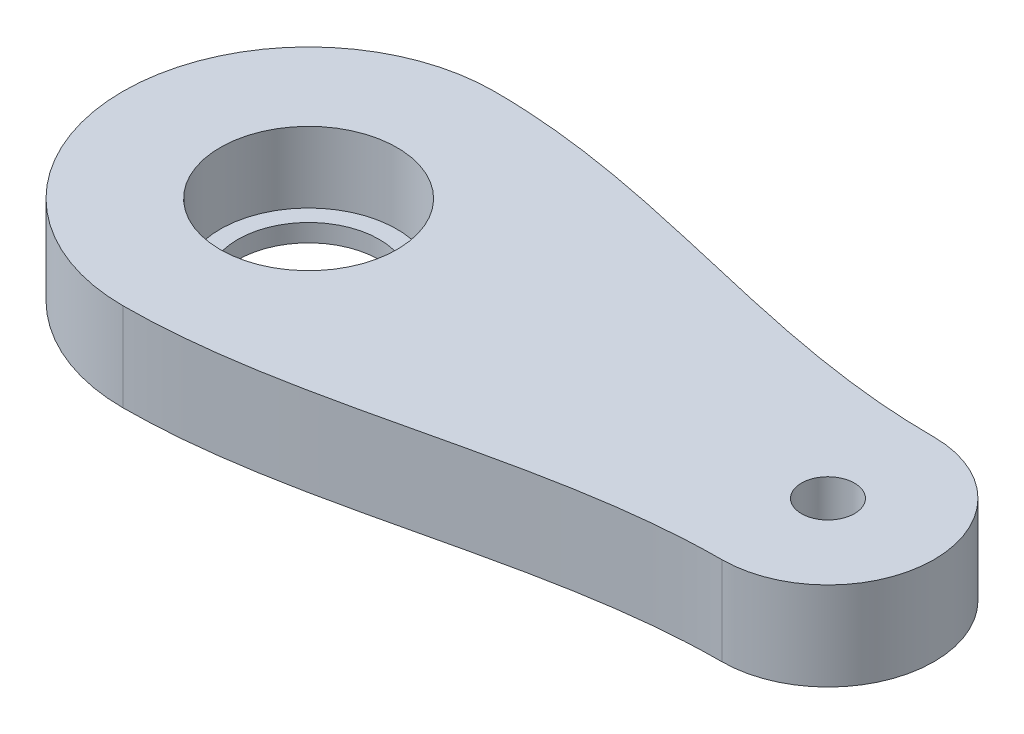
ISO-10303-21;
HEADER;
FILE_DESCRIPTION(('STEP AP214'),'2;1');
FILE_NAME('part.step','',(''),(''),'','','');
FILE_SCHEMA(('AUTOMOTIVE_DESIGN { 1 0 10303 214 1 1 1 1 }'));
ENDSEC;
DATA;
#1=APPLICATION_CONTEXT('core data for automotive mechanical design processes');
#2=APPLICATION_PROTOCOL_DEFINITION('international standard','automotive_design',2000,#1);
#3=PRODUCT_CONTEXT('',#1,'mechanical');
#4=PRODUCT('Part','Part','',(#3));
#5=PRODUCT_RELATED_PRODUCT_CATEGORY('part','',(#4));
#6=PRODUCT_DEFINITION_FORMATION('','',#4);
#7=PRODUCT_DEFINITION_CONTEXT('part definition',#1,'design');
#8=PRODUCT_DEFINITION('design','',#6,#7);
#9=PRODUCT_DEFINITION_SHAPE('','',#8);
#10=(LENGTH_UNIT() NAMED_UNIT(*) SI_UNIT(.MILLI.,.METRE.));
#11=(NAMED_UNIT(*) PLANE_ANGLE_UNIT() SI_UNIT($,.RADIAN.));
#12=(NAMED_UNIT(*) SI_UNIT($,.STERADIAN.) SOLID_ANGLE_UNIT());
#13=UNCERTAINTY_MEASURE_WITH_UNIT(LENGTH_MEASURE(1.E-05),#10,'distance_accuracy_value','');
#14=(GEOMETRIC_REPRESENTATION_CONTEXT(3) GLOBAL_UNCERTAINTY_ASSIGNED_CONTEXT((#13)) GLOBAL_UNIT_ASSIGNED_CONTEXT((#10,
#11,#12)) REPRESENTATION_CONTEXT('',''));
#15=CARTESIAN_POINT('',(0.,0.,0.));
#16=DIRECTION('',(0.,0.,1.));
#17=DIRECTION('',(1.,0.,0.));
#18=AXIS2_PLACEMENT_3D('',#15,#16,#17);
#19=CARTESIAN_POINT('',(-29.37,5.,10.5));
#20=CARTESIAN_POINT('',(-19.4690483061251,5.,10.5));
#21=CARTESIAN_POINT('',(-10.1269426076843,5.,6.));
#22=CARTESIAN_POINT('',(0.,5.,6.));
#23=B_SPLINE_CURVE_WITH_KNOTS('',3,(#19,#20,#21,#22),.UNSPECIFIED.,.F.,.F.,(4,4),(0.,1.),.UNSPECIFIED.);
#24=DIRECTION('',(0.,-1.,0.));
#25=VECTOR('',#24,1.);
#26=SURFACE_OF_LINEAR_EXTRUSION('',#23,#25);
#27=CARTESIAN_POINT('',(-29.37,0.,10.5));
#28=CARTESIAN_POINT('',(-19.4690483061251,0.,10.5));
#29=CARTESIAN_POINT('',(-10.1269426076843,0.,6.));
#30=CARTESIAN_POINT('',(0.,0.,6.));
#31=B_SPLINE_CURVE_WITH_KNOTS('',3,(#27,#28,#29,#30),.UNSPECIFIED.,.F.,.F.,(4,4),(0.,1.),.UNSPECIFIED.);
#32=CARTESIAN_POINT('',(-29.37,0.,10.5));
#33=VERTEX_POINT('',#32);
#34=CARTESIAN_POINT('',(0.,0.,6.));
#35=VERTEX_POINT('',#34);
#36=EDGE_CURVE('E124',#33,#35,#31,.T.);
#37=ORIENTED_EDGE('',*,*,#36,.T.);
#38=DIRECTION('',(0.,-1.,0.));
#39=VECTOR('',#38,1.);
#40=CARTESIAN_POINT('',(0.,5.,6.));
#41=LINE('',#40,#39);
#42=CARTESIAN_POINT('',(0.,5.,6.));
#43=VERTEX_POINT('',#42);
#44=EDGE_CURVE('E11',#43,#35,#41,.T.);
#45=ORIENTED_EDGE('',*,*,#44,.F.);
#46=CARTESIAN_POINT('',(-29.37,5.,10.5));
#47=VERTEX_POINT('',#46);
#48=EDGE_CURVE('E92',#47,#43,#23,.T.);
#49=ORIENTED_EDGE('',*,*,#48,.F.);
#50=DIRECTION('',(0.,-1.,0.));
#51=VECTOR('',#50,1.);
#52=CARTESIAN_POINT('',(-29.37,5.,10.5));
#53=LINE('',#52,#51);
#54=EDGE_CURVE('E101',#47,#33,#53,.T.);
#55=ORIENTED_EDGE('',*,*,#54,.T.);
#56=EDGE_LOOP('',(#37,#45,#49,#55));
#57=FACE_BOUND('',#56,.T.);
#58=ADVANCED_FACE('F39',(#57),#26,.F.);
#59=CARTESIAN_POINT('',(0.,5.,0.));
#60=DIRECTION('',(0.,-1.,0.));
#61=DIRECTION('',(0.,0.,-1.));
#62=AXIS2_PLACEMENT_3D('',#59,#60,#61);
#63=CYLINDRICAL_SURFACE('',#62,6.);
#64=CARTESIAN_POINT('',(0.,0.,0.));
#65=DIRECTION('',(0.,1.,0.));
#66=DIRECTION('',(0.,0.,1.));
#67=AXIS2_PLACEMENT_3D('',#64,#65,#66);
#68=CIRCLE('',#67,6.);
#69=CARTESIAN_POINT('',(0.,0.,-6.));
#70=VERTEX_POINT('',#69);
#71=EDGE_CURVE('E96',#35,#70,#68,.T.);
#72=ORIENTED_EDGE('',*,*,#71,.T.);
#73=DIRECTION('',(0.,-1.,0.));
#74=VECTOR('',#73,1.);
#75=CARTESIAN_POINT('',(0.,5.,-6.));
#76=LINE('',#75,#74);
#77=CARTESIAN_POINT('',(0.,5.,-6.));
#78=VERTEX_POINT('',#77);
#79=EDGE_CURVE('E49',#78,#70,#76,.T.);
#80=ORIENTED_EDGE('',*,*,#79,.F.);
#81=CARTESIAN_POINT('',(0.,5.,0.));
#82=DIRECTION('',(0.,1.,0.));
#83=DIRECTION('',(0.,0.,1.));
#84=AXIS2_PLACEMENT_3D('',#81,#82,#83);
#85=CIRCLE('',#84,6.);
#86=EDGE_CURVE('E87',#43,#78,#85,.T.);
#87=ORIENTED_EDGE('',*,*,#86,.F.);
#88=ORIENTED_EDGE('',*,*,#44,.T.);
#89=EDGE_LOOP('',(#72,#80,#87,#88));
#90=FACE_BOUND('',#89,.T.);
#91=ADVANCED_FACE('F95',(#90),#63,.T.);
#92=CARTESIAN_POINT('',(0.,5.,-6.));
#93=CARTESIAN_POINT('',(-10.1269426076843,5.,-6.));
#94=CARTESIAN_POINT('',(-19.4690483061251,5.,-10.5));
#95=CARTESIAN_POINT('',(-29.37,5.,-10.5));
#96=B_SPLINE_CURVE_WITH_KNOTS('',3,(#92,#93,#94,#95),.UNSPECIFIED.,.F.,.F.,(4,4),(0.,1.),.UNSPECIFIED.);
#97=DIRECTION('',(0.,-1.,0.));
#98=VECTOR('',#97,1.);
#99=SURFACE_OF_LINEAR_EXTRUSION('',#96,#98);
#100=CARTESIAN_POINT('',(0.,0.,-6.));
#101=CARTESIAN_POINT('',(-10.1269426076843,0.,-6.));
#102=CARTESIAN_POINT('',(-19.4690483061251,0.,-10.5));
#103=CARTESIAN_POINT('',(-29.37,0.,-10.5));
#104=B_SPLINE_CURVE_WITH_KNOTS('',3,(#100,#101,#102,#103),.UNSPECIFIED.,.F.,.F.,(4,4),(0.,1.),.UNSPECIFIED.);
#105=CARTESIAN_POINT('',(-29.37,0.,-10.5));
#106=VERTEX_POINT('',#105);
#107=EDGE_CURVE('E74',#70,#106,#104,.T.);
#108=ORIENTED_EDGE('',*,*,#107,.T.);
#109=DIRECTION('',(0.,-1.,0.));
#110=VECTOR('',#109,1.);
#111=CARTESIAN_POINT('',(-29.37,5.,-10.5));
#112=LINE('',#111,#110);
#113=CARTESIAN_POINT('',(-29.37,5.,-10.5));
#114=VERTEX_POINT('',#113);
#115=EDGE_CURVE('E97',#114,#106,#112,.T.);
#116=ORIENTED_EDGE('',*,*,#115,.F.);
#117=EDGE_CURVE('E90',#78,#114,#96,.T.);
#118=ORIENTED_EDGE('',*,*,#117,.F.);
#119=ORIENTED_EDGE('',*,*,#79,.T.);
#120=EDGE_LOOP('',(#108,#116,#118,#119));
#121=FACE_BOUND('',#120,.T.);
#122=ADVANCED_FACE('F99',(#121),#99,.F.);
#123=CARTESIAN_POINT('',(-29.37,5.,0.));
#124=DIRECTION('',(0.,-1.,0.));
#125=DIRECTION('',(0.,0.,-1.));
#126=AXIS2_PLACEMENT_3D('',#123,#124,#125);
#127=CYLINDRICAL_SURFACE('',#126,10.5);
#128=CARTESIAN_POINT('',(-29.37,0.,0.));
#129=DIRECTION('',(0.,1.,0.));
#130=DIRECTION('',(0.,0.,1.));
#131=AXIS2_PLACEMENT_3D('',#128,#129,#130);
#132=CIRCLE('',#131,10.5);
#133=EDGE_CURVE('E80',#106,#33,#132,.T.);
#134=ORIENTED_EDGE('',*,*,#133,.T.);
#135=ORIENTED_EDGE('',*,*,#54,.F.);
#136=CARTESIAN_POINT('',(-29.37,5.,0.));
#137=DIRECTION('',(0.,1.,0.));
#138=DIRECTION('',(0.,0.,1.));
#139=AXIS2_PLACEMENT_3D('',#136,#137,#138);
#140=CIRCLE('',#139,10.5);
#141=EDGE_CURVE('E57',#114,#47,#140,.T.);
#142=ORIENTED_EDGE('',*,*,#141,.F.);
#143=ORIENTED_EDGE('',*,*,#115,.T.);
#144=EDGE_LOOP('',(#134,#135,#142,#143));
#145=FACE_BOUND('',#144,.T.);
#146=ADVANCED_FACE('F113',(#145),#127,.T.);
#147=CARTESIAN_POINT('',(-14.7697465926785,5.,8.25));
#148=DIRECTION('',(0.,-1.,0.));
#149=DIRECTION('',(0.,0.,-1.));
#150=AXIS2_PLACEMENT_3D('',#147,#148,#149);
#151=PLANE('',#150);
#152=CARTESIAN_POINT('',(0.,5.,0.));
#153=DIRECTION('',(0.,1.,0.));
#154=DIRECTION('',(0.,0.,1.));
#155=AXIS2_PLACEMENT_3D('',#152,#153,#154);
#156=CIRCLE('',#155,1.5);
#157=CARTESIAN_POINT('',(0.,5.,1.5));
#158=VERTEX_POINT('',#157);
#159=EDGE_CURVE('E126',#158,#158,#156,.T.);
#160=ORIENTED_EDGE('',*,*,#159,.F.);
#161=EDGE_LOOP('',(#160));
#162=FACE_BOUND('',#161,.T.);
#163=CARTESIAN_POINT('',(-29.37,5.,0.));
#164=DIRECTION('',(0.,1.,0.));
#165=DIRECTION('',(0.,0.,1.));
#166=AXIS2_PLACEMENT_3D('',#163,#164,#165);
#167=CIRCLE('',#166,5.);
#168=CARTESIAN_POINT('',(-29.37,5.,5.));
#169=VERTEX_POINT('',#168);
#170=EDGE_CURVE('E129',#169,#169,#167,.T.);
#171=ORIENTED_EDGE('',*,*,#170,.F.);
#172=EDGE_LOOP('',(#171));
#173=FACE_BOUND('',#172,.T.);
#174=ORIENTED_EDGE('',*,*,#48,.T.);
#175=ORIENTED_EDGE('',*,*,#86,.T.);
#176=ORIENTED_EDGE('',*,*,#117,.T.);
#177=ORIENTED_EDGE('',*,*,#141,.T.);
#178=EDGE_LOOP('',(#174,#175,#176,#177));
#179=FACE_BOUND('',#178,.T.);
#180=ADVANCED_FACE('F88',(#162,#173,#179),#151,.F.);
#181=CARTESIAN_POINT('',(-14.7697465926785,0.,8.25));
#182=DIRECTION('',(0.,-1.,0.));
#183=DIRECTION('',(0.,0.,-1.));
#184=AXIS2_PLACEMENT_3D('',#181,#182,#183);
#185=PLANE('',#184);
#186=CARTESIAN_POINT('',(0.,0.,0.));
#187=DIRECTION('',(0.,-1.,0.));
#188=DIRECTION('',(0.,0.,-1.));
#189=AXIS2_PLACEMENT_3D('',#186,#187,#188);
#190=CIRCLE('',#189,1.5);
#191=CARTESIAN_POINT('',(0.,0.,-1.5));
#192=VERTEX_POINT('',#191);
#193=EDGE_CURVE('E179',#192,#192,#190,.T.);
#194=ORIENTED_EDGE('',*,*,#193,.F.);
#195=EDGE_LOOP('',(#194));
#196=FACE_BOUND('',#195,.T.);
#197=CARTESIAN_POINT('',(-29.37,0.,0.));
#198=DIRECTION('',(0.,-1.,0.));
#199=DIRECTION('',(0.,0.,-1.));
#200=AXIS2_PLACEMENT_3D('',#197,#198,#199);
#201=CIRCLE('',#200,4.);
#202=CARTESIAN_POINT('',(-29.37,0.,-4.));
#203=VERTEX_POINT('',#202);
#204=EDGE_CURVE('E178',#203,#203,#201,.T.);
#205=ORIENTED_EDGE('',*,*,#204,.F.);
#206=EDGE_LOOP('',(#205));
#207=FACE_BOUND('',#206,.T.);
#208=ORIENTED_EDGE('',*,*,#36,.F.);
#209=ORIENTED_EDGE('',*,*,#133,.F.);
#210=ORIENTED_EDGE('',*,*,#107,.F.);
#211=ORIENTED_EDGE('',*,*,#71,.F.);
#212=EDGE_LOOP('',(#208,#209,#210,#211));
#213=FACE_BOUND('',#212,.T.);
#214=ADVANCED_FACE('F145',(#196,#207,#213),#185,.T.);
#215=CARTESIAN_POINT('',(-29.37,1.,0.));
#216=DIRECTION('',(0.,1.,0.));
#217=DIRECTION('',(0.,0.,1.));
#218=AXIS2_PLACEMENT_3D('',#215,#216,#217);
#219=CYLINDRICAL_SURFACE('',#218,5.);
#220=CARTESIAN_POINT('',(-29.37,1.,0.));
#221=DIRECTION('',(0.,1.,0.));
#222=DIRECTION('',(0.,0.,1.));
#223=AXIS2_PLACEMENT_3D('',#220,#221,#222);
#224=CIRCLE('',#223,5.);
#225=CARTESIAN_POINT('',(-29.37,1.,5.));
#226=VERTEX_POINT('',#225);
#227=EDGE_CURVE('E181',#226,#226,#224,.T.);
#228=ORIENTED_EDGE('',*,*,#227,.F.);
#229=EDGE_LOOP('',(#228));
#230=FACE_BOUND('',#229,.T.);
#231=ORIENTED_EDGE('',*,*,#170,.T.);
#232=EDGE_LOOP('',(#231));
#233=FACE_BOUND('',#232,.T.);
#234=ADVANCED_FACE('F147',(#230,#233),#219,.F.);
#235=CARTESIAN_POINT('',(-29.37,1.,0.));
#236=DIRECTION('',(0.,1.,0.));
#237=DIRECTION('',(0.,0.,1.));
#238=AXIS2_PLACEMENT_3D('',#235,#236,#237);
#239=PLANE('',#238);
#240=CARTESIAN_POINT('',(-29.37,0.999999999999999,0.));
#241=DIRECTION('',(0.,1.,0.));
#242=DIRECTION('',(0.,0.,1.));
#243=AXIS2_PLACEMENT_3D('',#240,#241,#242);
#244=CIRCLE('',#243,4.);
#245=CARTESIAN_POINT('',(-29.37,0.999999999999999,4.00000000000001));
#246=VERTEX_POINT('',#245);
#247=EDGE_CURVE('E43',#246,#246,#244,.T.);
#248=ORIENTED_EDGE('',*,*,#247,.F.);
#249=EDGE_LOOP('',(#248));
#250=FACE_BOUND('',#249,.T.);
#251=ORIENTED_EDGE('',*,*,#227,.T.);
#252=EDGE_LOOP('',(#251));
#253=FACE_BOUND('',#252,.T.);
#254=ADVANCED_FACE('F153',(#250,#253),#239,.T.);
#255=CARTESIAN_POINT('',(0.,1.,0.));
#256=DIRECTION('',(0.,1.,0.));
#257=DIRECTION('',(0.,0.,1.));
#258=AXIS2_PLACEMENT_3D('',#255,#256,#257);
#259=CYLINDRICAL_SURFACE('',#258,1.5);
#260=ORIENTED_EDGE('',*,*,#159,.T.);
#261=EDGE_LOOP('',(#260));
#262=FACE_BOUND('',#261,.T.);
#263=ORIENTED_EDGE('',*,*,#193,.T.);
#264=EDGE_LOOP('',(#263));
#265=FACE_BOUND('',#264,.T.);
#266=ADVANCED_FACE('F162',(#262,#265),#259,.F.);
#267=CARTESIAN_POINT('',(-29.37,10.,0.));
#268=DIRECTION('',(0.,-1.,0.));
#269=DIRECTION('',(0.,0.,-1.));
#270=AXIS2_PLACEMENT_3D('',#267,#268,#269);
#271=CYLINDRICAL_SURFACE('',#270,4.);
#272=ORIENTED_EDGE('',*,*,#247,.T.);
#273=EDGE_LOOP('',(#272));
#274=FACE_BOUND('',#273,.T.);
#275=ORIENTED_EDGE('',*,*,#204,.T.);
#276=EDGE_LOOP('',(#275));
#277=FACE_BOUND('',#276,.T.);
#278=ADVANCED_FACE('F167',(#274,#277),#271,.F.);
#279=CLOSED_SHELL('',(#58,#91,#122,#146,#180,#214,#234,#254,#266,#278));
#280=MANIFOLD_SOLID_BREP('B2',#279);
#281=ADVANCED_BREP_SHAPE_REPRESENTATION('',(#18,#280),#14);
#282=SHAPE_DEFINITION_REPRESENTATION(#9,#281);
ENDSEC;
END-ISO-10303-21;
